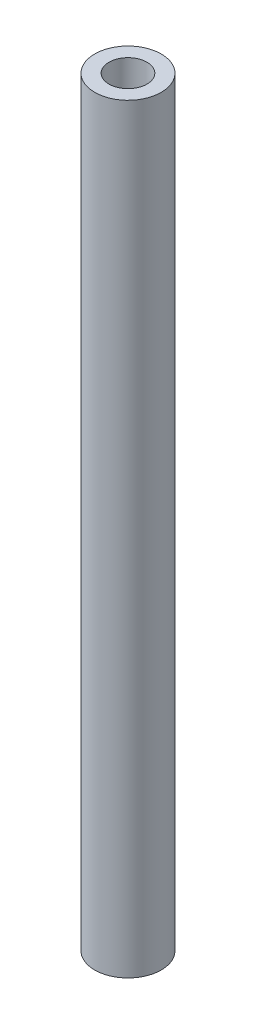
ISO-10303-21;
HEADER;
FILE_DESCRIPTION(('STEP AP214'),'2;1');
FILE_NAME('part.step','',(''),(''),'','','');
FILE_SCHEMA(('AUTOMOTIVE_DESIGN { 1 0 10303 214 1 1 1 1 }'));
ENDSEC;
DATA;
#1=APPLICATION_CONTEXT('core data for automotive mechanical design processes');
#2=APPLICATION_PROTOCOL_DEFINITION('international standard','automotive_design',2000,#1);
#3=PRODUCT_CONTEXT('',#1,'mechanical');
#4=PRODUCT('Part','Part','',(#3));
#5=PRODUCT_RELATED_PRODUCT_CATEGORY('part','',(#4));
#6=PRODUCT_DEFINITION_FORMATION('','',#4);
#7=PRODUCT_DEFINITION_CONTEXT('part definition',#1,'design');
#8=PRODUCT_DEFINITION('design','',#6,#7);
#9=PRODUCT_DEFINITION_SHAPE('','',#8);
#10=(LENGTH_UNIT() NAMED_UNIT(*) SI_UNIT(.MILLI.,.METRE.));
#11=(NAMED_UNIT(*) PLANE_ANGLE_UNIT() SI_UNIT($,.RADIAN.));
#12=(NAMED_UNIT(*) SI_UNIT($,.STERADIAN.) SOLID_ANGLE_UNIT());
#13=UNCERTAINTY_MEASURE_WITH_UNIT(LENGTH_MEASURE(1.E-05),#10,'distance_accuracy_value','');
#14=(GEOMETRIC_REPRESENTATION_CONTEXT(3) GLOBAL_UNCERTAINTY_ASSIGNED_CONTEXT((#13)) GLOBAL_UNIT_ASSIGNED_CONTEXT((#10,
#11,#12)) REPRESENTATION_CONTEXT('',''));
#15=CARTESIAN_POINT('',(0.,0.,0.));
#16=DIRECTION('',(0.,0.,1.));
#17=DIRECTION('',(1.,0.,0.));
#18=AXIS2_PLACEMENT_3D('',#15,#16,#17);
#19=CARTESIAN_POINT('',(0.,80.,0.));
#20=DIRECTION('',(0.,1.,0.));
#21=DIRECTION('',(0.,0.,1.));
#22=AXIS2_PLACEMENT_3D('',#19,#20,#21);
#23=PLANE('',#22);
#24=CARTESIAN_POINT('',(0.,80.,0.));
#25=DIRECTION('',(0.,1.,0.));
#26=DIRECTION('',(0.,0.,1.));
#27=AXIS2_PLACEMENT_3D('',#24,#25,#26);
#28=CIRCLE('',#27,3.5);
#29=CARTESIAN_POINT('',(0.,80.,3.5));
#30=VERTEX_POINT('',#29);
#31=EDGE_CURVE('E10',#30,#30,#28,.T.);
#32=ORIENTED_EDGE('',*,*,#31,.T.);
#33=EDGE_LOOP('',(#32));
#34=FACE_BOUND('',#33,.T.);
#35=CARTESIAN_POINT('',(0.,80.,0.));
#36=DIRECTION('',(0.,1.,0.));
#37=DIRECTION('',(0.,0.,1.));
#38=AXIS2_PLACEMENT_3D('',#35,#36,#37);
#39=CIRCLE('',#38,2.);
#40=CARTESIAN_POINT('',(0.,80.,2.));
#41=VERTEX_POINT('',#40);
#42=EDGE_CURVE('E44',#41,#41,#39,.T.);
#43=ORIENTED_EDGE('',*,*,#42,.F.);
#44=EDGE_LOOP('',(#43));
#45=FACE_BOUND('',#44,.T.);
#46=ADVANCED_FACE('F33',(#34,#45),#23,.T.);
#47=CARTESIAN_POINT('',(0.,0.,0.));
#48=DIRECTION('',(0.,1.,0.));
#49=DIRECTION('',(0.,0.,1.));
#50=AXIS2_PLACEMENT_3D('',#47,#48,#49);
#51=PLANE('',#50);
#52=CARTESIAN_POINT('',(0.,0.,0.));
#53=DIRECTION('',(0.,1.,0.));
#54=DIRECTION('',(0.,0.,1.));
#55=AXIS2_PLACEMENT_3D('',#52,#53,#54);
#56=CIRCLE('',#55,3.5);
#57=CARTESIAN_POINT('',(0.,0.,3.5));
#58=VERTEX_POINT('',#57);
#59=EDGE_CURVE('E37',#58,#58,#56,.T.);
#60=ORIENTED_EDGE('',*,*,#59,.F.);
#61=EDGE_LOOP('',(#60));
#62=FACE_BOUND('',#61,.T.);
#63=CARTESIAN_POINT('',(0.,0.,0.));
#64=DIRECTION('',(0.,1.,0.));
#65=DIRECTION('',(0.,0.,1.));
#66=AXIS2_PLACEMENT_3D('',#63,#64,#65);
#67=CIRCLE('',#66,2.);
#68=CARTESIAN_POINT('',(0.,0.,2.));
#69=VERTEX_POINT('',#68);
#70=EDGE_CURVE('E46',#69,#69,#67,.T.);
#71=ORIENTED_EDGE('',*,*,#70,.T.);
#72=EDGE_LOOP('',(#71));
#73=FACE_BOUND('',#72,.T.);
#74=ADVANCED_FACE('F56',(#62,#73),#51,.F.);
#75=CARTESIAN_POINT('',(0.,80.,0.));
#76=DIRECTION('',(0.,-1.,0.));
#77=DIRECTION('',(0.,0.,-1.));
#78=AXIS2_PLACEMENT_3D('',#75,#76,#77);
#79=CYLINDRICAL_SURFACE('',#78,3.5);
#80=ORIENTED_EDGE('',*,*,#31,.F.);
#81=EDGE_LOOP('',(#80));
#82=FACE_BOUND('',#81,.T.);
#83=ORIENTED_EDGE('',*,*,#59,.T.);
#84=EDGE_LOOP('',(#83));
#85=FACE_BOUND('',#84,.T.);
#86=ADVANCED_FACE('F35',(#82,#85),#79,.T.);
#87=CARTESIAN_POINT('',(0.,80.,0.));
#88=DIRECTION('',(0.,-1.,0.));
#89=DIRECTION('',(0.,0.,-1.));
#90=AXIS2_PLACEMENT_3D('',#87,#88,#89);
#91=CYLINDRICAL_SURFACE('',#90,2.);
#92=ORIENTED_EDGE('',*,*,#42,.T.);
#93=EDGE_LOOP('',(#92));
#94=FACE_BOUND('',#93,.T.);
#95=ORIENTED_EDGE('',*,*,#70,.F.);
#96=EDGE_LOOP('',(#95));
#97=FACE_BOUND('',#96,.T.);
#98=ADVANCED_FACE('F52',(#94,#97),#91,.F.);
#99=CLOSED_SHELL('',(#46,#74,#86,#98));
#100=MANIFOLD_SOLID_BREP('B2',#99);
#101=ADVANCED_BREP_SHAPE_REPRESENTATION('',(#18,#100),#14);
#102=SHAPE_DEFINITION_REPRESENTATION(#9,#101);
ENDSEC;
END-ISO-10303-21;
